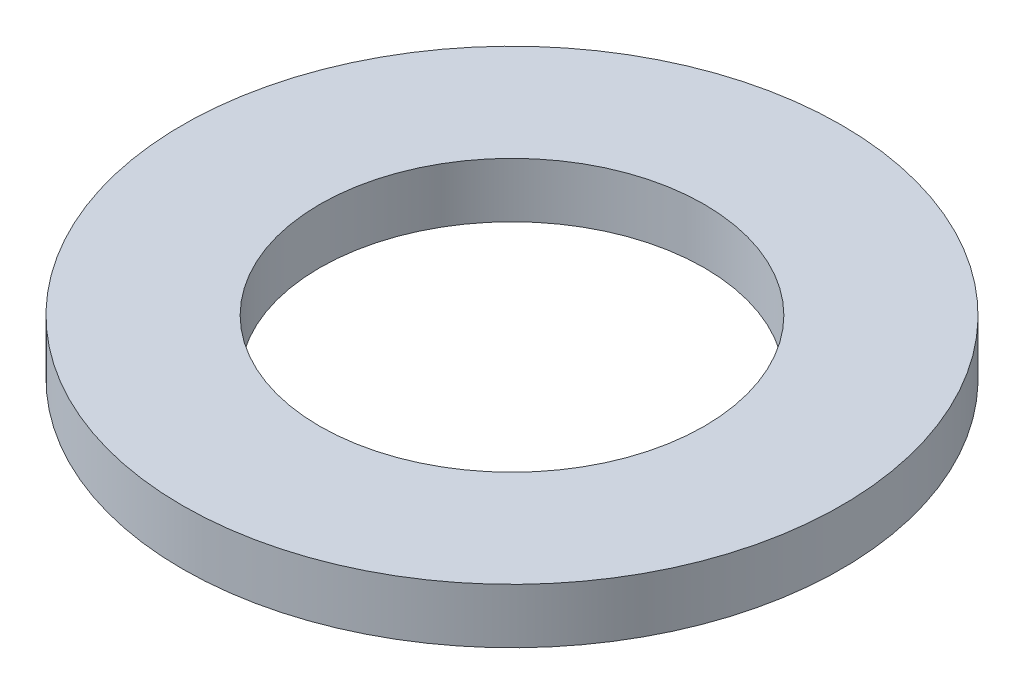
ISO-10303-21;
HEADER;
FILE_DESCRIPTION(('STEP AP214'),'2;1');
FILE_NAME('part.step','',(''),(''),'','','');
FILE_SCHEMA(('AUTOMOTIVE_DESIGN { 1 0 10303 214 1 1 1 1 }'));
ENDSEC;
DATA;
#1=APPLICATION_CONTEXT('core data for automotive mechanical design processes');
#2=APPLICATION_PROTOCOL_DEFINITION('international standard','automotive_design',2000,#1);
#3=PRODUCT_CONTEXT('',#1,'mechanical');
#4=PRODUCT('Part','Part','',(#3));
#5=PRODUCT_RELATED_PRODUCT_CATEGORY('part','',(#4));
#6=PRODUCT_DEFINITION_FORMATION('','',#4);
#7=PRODUCT_DEFINITION_CONTEXT('part definition',#1,'design');
#8=PRODUCT_DEFINITION('design','',#6,#7);
#9=PRODUCT_DEFINITION_SHAPE('','',#8);
#10=(LENGTH_UNIT() NAMED_UNIT(*) SI_UNIT(.MILLI.,.METRE.));
#11=(NAMED_UNIT(*) PLANE_ANGLE_UNIT() SI_UNIT($,.RADIAN.));
#12=(NAMED_UNIT(*) SI_UNIT($,.STERADIAN.) SOLID_ANGLE_UNIT());
#13=UNCERTAINTY_MEASURE_WITH_UNIT(LENGTH_MEASURE(1.E-05),#10,'distance_accuracy_value','');
#14=(GEOMETRIC_REPRESENTATION_CONTEXT(3) GLOBAL_UNCERTAINTY_ASSIGNED_CONTEXT((#13)) GLOBAL_UNIT_ASSIGNED_CONTEXT((#10,
#11,#12)) REPRESENTATION_CONTEXT('',''));
#15=CARTESIAN_POINT('',(0.,0.,0.));
#16=DIRECTION('',(0.,0.,1.));
#17=DIRECTION('',(1.,0.,0.));
#18=AXIS2_PLACEMENT_3D('',#15,#16,#17);
#19=CARTESIAN_POINT('',(0.,1.,0.));
#20=DIRECTION('',(0.,1.,0.));
#21=DIRECTION('',(0.,0.,1.));
#22=AXIS2_PLACEMENT_3D('',#19,#20,#21);
#23=PLANE('',#22);
#24=CARTESIAN_POINT('',(0.,1.,0.));
#25=DIRECTION('',(0.,1.,0.));
#26=DIRECTION('',(0.,0.,1.));
#27=AXIS2_PLACEMENT_3D('',#24,#25,#26);
#28=CIRCLE('',#27,6.);
#29=CARTESIAN_POINT('',(0.,1.,6.));
#30=VERTEX_POINT('',#29);
#31=EDGE_CURVE('E10',#30,#30,#28,.T.);
#32=ORIENTED_EDGE('',*,*,#31,.T.);
#33=EDGE_LOOP('',(#32));
#34=FACE_BOUND('',#33,.T.);
#35=CARTESIAN_POINT('',(0.,1.,0.));
#36=DIRECTION('',(0.,1.,0.));
#37=DIRECTION('',(0.,0.,1.));
#38=AXIS2_PLACEMENT_3D('',#35,#36,#37);
#39=CIRCLE('',#38,3.5);
#40=CARTESIAN_POINT('',(0.,1.,3.5));
#41=VERTEX_POINT('',#40);
#42=EDGE_CURVE('E50',#41,#41,#39,.T.);
#43=ORIENTED_EDGE('',*,*,#42,.F.);
#44=EDGE_LOOP('',(#43));
#45=FACE_BOUND('',#44,.T.);
#46=ADVANCED_FACE('F37',(#34,#45),#23,.T.);
#47=CARTESIAN_POINT('',(0.,0.,0.));
#48=DIRECTION('',(0.,1.,0.));
#49=DIRECTION('',(0.,0.,1.));
#50=AXIS2_PLACEMENT_3D('',#47,#48,#49);
#51=PLANE('',#50);
#52=CARTESIAN_POINT('',(0.,0.,0.));
#53=DIRECTION('',(0.,1.,0.));
#54=DIRECTION('',(0.,0.,1.));
#55=AXIS2_PLACEMENT_3D('',#52,#53,#54);
#56=CIRCLE('',#55,6.);
#57=CARTESIAN_POINT('',(0.,0.,6.));
#58=VERTEX_POINT('',#57);
#59=EDGE_CURVE('E41',#58,#58,#56,.T.);
#60=ORIENTED_EDGE('',*,*,#59,.F.);
#61=EDGE_LOOP('',(#60));
#62=FACE_BOUND('',#61,.T.);
#63=CARTESIAN_POINT('',(0.,0.,0.));
#64=DIRECTION('',(0.,1.,0.));
#65=DIRECTION('',(0.,0.,1.));
#66=AXIS2_PLACEMENT_3D('',#63,#64,#65);
#67=CIRCLE('',#66,3.5);
#68=CARTESIAN_POINT('',(0.,0.,3.5));
#69=VERTEX_POINT('',#68);
#70=EDGE_CURVE('E52',#69,#69,#67,.T.);
#71=ORIENTED_EDGE('',*,*,#70,.T.);
#72=EDGE_LOOP('',(#71));
#73=FACE_BOUND('',#72,.T.);
#74=ADVANCED_FACE('F64',(#62,#73),#51,.F.);
#75=CARTESIAN_POINT('',(0.,1.,0.));
#76=DIRECTION('',(0.,-1.,0.));
#77=DIRECTION('',(0.,0.,-1.));
#78=AXIS2_PLACEMENT_3D('',#75,#76,#77);
#79=CYLINDRICAL_SURFACE('',#78,6.);
#80=ORIENTED_EDGE('',*,*,#31,.F.);
#81=EDGE_LOOP('',(#80));
#82=FACE_BOUND('',#81,.T.);
#83=ORIENTED_EDGE('',*,*,#59,.T.);
#84=EDGE_LOOP('',(#83));
#85=FACE_BOUND('',#84,.T.);
#86=ADVANCED_FACE('F39',(#82,#85),#79,.T.);
#87=CARTESIAN_POINT('',(0.,1.,0.));
#88=DIRECTION('',(0.,-1.,0.));
#89=DIRECTION('',(0.,0.,-1.));
#90=AXIS2_PLACEMENT_3D('',#87,#88,#89);
#91=CYLINDRICAL_SURFACE('',#90,3.5);
#92=ORIENTED_EDGE('',*,*,#42,.T.);
#93=EDGE_LOOP('',(#92));
#94=FACE_BOUND('',#93,.T.);
#95=ORIENTED_EDGE('',*,*,#70,.F.);
#96=EDGE_LOOP('',(#95));
#97=FACE_BOUND('',#96,.T.);
#98=ADVANCED_FACE('F60',(#94,#97),#91,.F.);
#99=CLOSED_SHELL('',(#46,#74,#86,#98));
#100=MANIFOLD_SOLID_BREP('B2',#99);
#101=ADVANCED_BREP_SHAPE_REPRESENTATION('',(#18,#100),#14);
#102=SHAPE_DEFINITION_REPRESENTATION(#9,#101);
ENDSEC;
END-ISO-10303-21;
